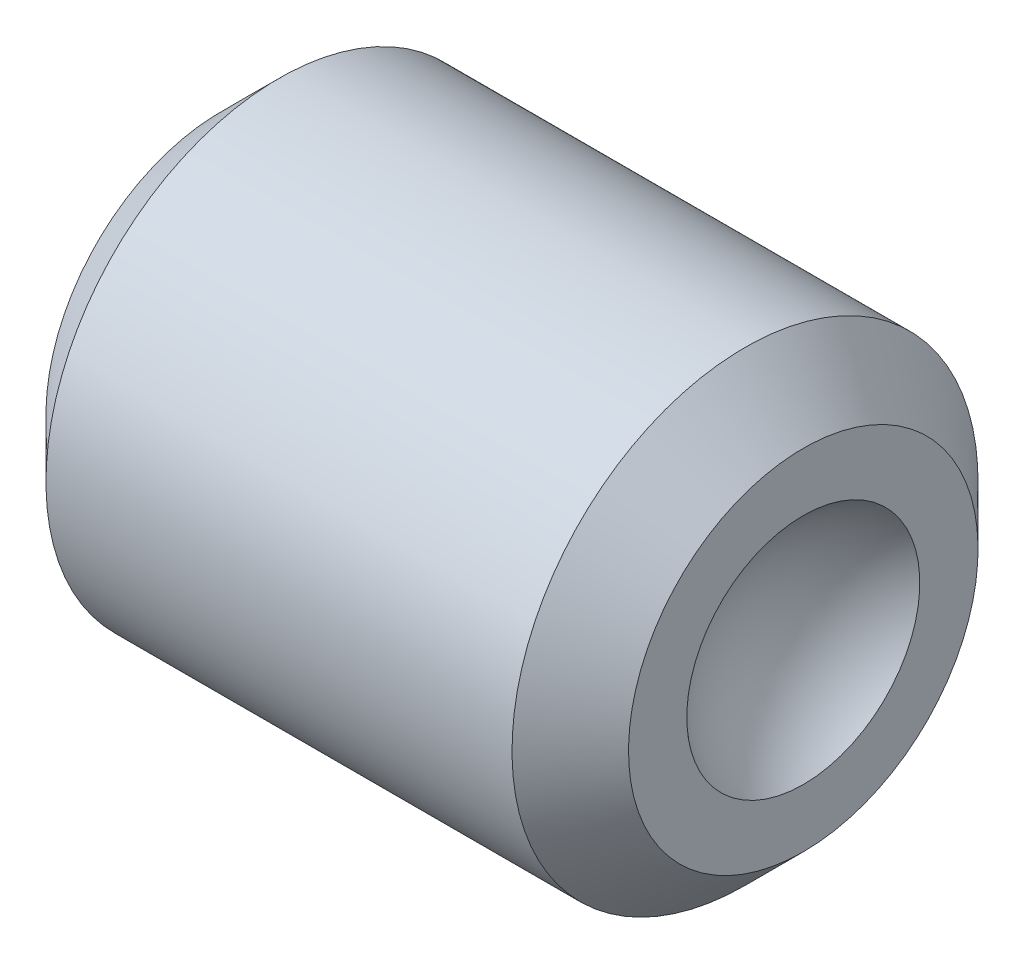
ISO-10303-21;
HEADER;
FILE_DESCRIPTION(('STEP AP214'),'2;1');
FILE_NAME('part.step','',(''),(''),'','','');
FILE_SCHEMA(('AUTOMOTIVE_DESIGN { 1 0 10303 214 1 1 1 1 }'));
ENDSEC;
DATA;
#1=APPLICATION_CONTEXT('core data for automotive mechanical design processes');
#2=APPLICATION_PROTOCOL_DEFINITION('international standard','automotive_design',2000,#1);
#3=PRODUCT_CONTEXT('',#1,'mechanical');
#4=PRODUCT('Part','Part','',(#3));
#5=PRODUCT_RELATED_PRODUCT_CATEGORY('part','',(#4));
#6=PRODUCT_DEFINITION_FORMATION('','',#4);
#7=PRODUCT_DEFINITION_CONTEXT('part definition',#1,'design');
#8=PRODUCT_DEFINITION('design','',#6,#7);
#9=PRODUCT_DEFINITION_SHAPE('','',#8);
#10=(LENGTH_UNIT() NAMED_UNIT(*) SI_UNIT(.MILLI.,.METRE.));
#11=(NAMED_UNIT(*) PLANE_ANGLE_UNIT() SI_UNIT($,.RADIAN.));
#12=(NAMED_UNIT(*) SI_UNIT($,.STERADIAN.) SOLID_ANGLE_UNIT());
#13=UNCERTAINTY_MEASURE_WITH_UNIT(LENGTH_MEASURE(1.E-05),#10,'distance_accuracy_value','');
#14=(GEOMETRIC_REPRESENTATION_CONTEXT(3) GLOBAL_UNCERTAINTY_ASSIGNED_CONTEXT((#13)) GLOBAL_UNIT_ASSIGNED_CONTEXT((#10,
#11,#12)) REPRESENTATION_CONTEXT('',''));
#15=CARTESIAN_POINT('',(0.,0.,0.));
#16=DIRECTION('',(0.,0.,1.));
#17=DIRECTION('',(1.,0.,0.));
#18=AXIS2_PLACEMENT_3D('',#15,#16,#17);
#19=CARTESIAN_POINT('',(0.,0.,0.));
#20=DIRECTION('',(1.,0.,0.));
#21=DIRECTION('',(0.,1.,0.));
#22=AXIS2_PLACEMENT_3D('',#19,#20,#21);
#23=PLANE('',#22);
#24=DIRECTION('',(0.,-0.5,-0.866025403784439));
#25=VECTOR('',#24,1.);
#26=CARTESIAN_POINT('',(0.,1.15470053837925,0.));
#27=LINE('',#26,#25);
#28=CARTESIAN_POINT('',(0.,1.15470053837925,0.));
#29=VERTEX_POINT('',#28);
#30=CARTESIAN_POINT('',(0.,0.577350269189626,-1.));
#31=VERTEX_POINT('',#30);
#32=EDGE_CURVE('E107',#29,#31,#27,.T.);
#33=ORIENTED_EDGE('',*,*,#32,.F.);
#34=DIRECTION('',(0.,0.5,-0.866025403784438));
#35=VECTOR('',#34,1.);
#36=CARTESIAN_POINT('',(0.,0.577350269189626,1.));
#37=LINE('',#36,#35);
#38=CARTESIAN_POINT('',(0.,0.577350269189626,1.));
#39=VERTEX_POINT('',#38);
#40=EDGE_CURVE('E49',#39,#29,#37,.T.);
#41=ORIENTED_EDGE('',*,*,#40,.F.);
#42=DIRECTION('',(0.,1.,0.));
#43=VECTOR('',#42,1.);
#44=CARTESIAN_POINT('',(0.,-0.577350269189626,1.));
#45=LINE('',#44,#43);
#46=CARTESIAN_POINT('',(0.,-0.577350269189626,1.));
#47=VERTEX_POINT('',#46);
#48=EDGE_CURVE('E122',#47,#39,#45,.T.);
#49=ORIENTED_EDGE('',*,*,#48,.F.);
#50=DIRECTION('',(0.,0.5,0.866025403784439));
#51=VECTOR('',#50,1.);
#52=CARTESIAN_POINT('',(0.,-1.15470053837925,0.));
#53=LINE('',#52,#51);
#54=CARTESIAN_POINT('',(0.,-1.15470053837925,0.));
#55=VERTEX_POINT('',#54);
#56=EDGE_CURVE('E116',#55,#47,#53,.T.);
#57=ORIENTED_EDGE('',*,*,#56,.F.);
#58=DIRECTION('',(0.,-0.5,0.866025403784438));
#59=VECTOR('',#58,1.);
#60=CARTESIAN_POINT('',(0.,-0.577350269189625,-1.));
#61=LINE('',#60,#59);
#62=CARTESIAN_POINT('',(0.,-0.577350269189625,-1.));
#63=VERTEX_POINT('',#62);
#64=EDGE_CURVE('E114',#63,#55,#61,.T.);
#65=ORIENTED_EDGE('',*,*,#64,.F.);
#66=DIRECTION('',(0.,-1.,0.));
#67=VECTOR('',#66,1.);
#68=CARTESIAN_POINT('',(0.,0.577350269189626,-1.));
#69=LINE('',#68,#67);
#70=EDGE_CURVE('E100',#31,#63,#69,.T.);
#71=ORIENTED_EDGE('',*,*,#70,.F.);
#72=EDGE_LOOP('',(#33,#41,#49,#57,#65,#71));
#73=FACE_BOUND('',#72,.T.);
#74=CARTESIAN_POINT('',(0.,0.,0.));
#75=DIRECTION('',(-1.,0.,0.));
#76=DIRECTION('',(0.,-1.,0.));
#77=AXIS2_PLACEMENT_3D('',#74,#75,#76);
#78=CIRCLE('',#77,1.5);
#79=CARTESIAN_POINT('',(0.,-1.5,0.));
#80=VERTEX_POINT('',#79);
#81=EDGE_CURVE('E12',#80,#80,#78,.T.);
#82=ORIENTED_EDGE('',*,*,#81,.T.);
#83=EDGE_LOOP('',(#82));
#84=FACE_BOUND('',#83,.T.);
#85=ADVANCED_FACE('F35',(#73,#84),#23,.F.);
#86=CARTESIAN_POINT('',(0.500000000000001,0.,0.));
#87=DIRECTION('',(1.,0.,0.));
#88=DIRECTION('',(0.,1.,0.));
#89=AXIS2_PLACEMENT_3D('',#86,#87,#88);
#90=CONICAL_SURFACE('',#89,2.,0.785398163397447);
#91=ORIENTED_EDGE('',*,*,#81,.F.);
#92=EDGE_LOOP('',(#91));
#93=FACE_BOUND('',#92,.T.);
#94=CARTESIAN_POINT('',(0.500000000000001,0.,0.));
#95=DIRECTION('',(-1.,0.,0.));
#96=DIRECTION('',(0.,-1.,0.));
#97=AXIS2_PLACEMENT_3D('',#94,#95,#96);
#98=CIRCLE('',#97,2.);
#99=CARTESIAN_POINT('',(0.500000000000001,-2.,0.));
#100=VERTEX_POINT('',#99);
#101=EDGE_CURVE('E42',#100,#100,#98,.T.);
#102=ORIENTED_EDGE('',*,*,#101,.T.);
#103=EDGE_LOOP('',(#102));
#104=FACE_BOUND('',#103,.T.);
#105=ADVANCED_FACE('F145',(#93,#104),#90,.T.);
#106=CARTESIAN_POINT('',(0.,0.,0.));
#107=DIRECTION('',(-1.,0.,0.));
#108=DIRECTION('',(0.,-1.,0.));
#109=AXIS2_PLACEMENT_3D('',#106,#107,#108);
#110=CYLINDRICAL_SURFACE('',#109,2.);
#111=ORIENTED_EDGE('',*,*,#101,.F.);
#112=EDGE_LOOP('',(#111));
#113=FACE_BOUND('',#112,.T.);
#114=CARTESIAN_POINT('',(4.5,0.,0.));
#115=DIRECTION('',(-1.,0.,0.));
#116=DIRECTION('',(0.,-1.,0.));
#117=AXIS2_PLACEMENT_3D('',#114,#115,#116);
#118=CIRCLE('',#117,2.);
#119=CARTESIAN_POINT('',(4.5,-2.,0.));
#120=VERTEX_POINT('',#119);
#121=EDGE_CURVE('E140',#120,#120,#118,.T.);
#122=ORIENTED_EDGE('',*,*,#121,.T.);
#123=EDGE_LOOP('',(#122));
#124=FACE_BOUND('',#123,.T.);
#125=ADVANCED_FACE('F147',(#113,#124),#110,.T.);
#126=CARTESIAN_POINT('',(5.,0.,0.));
#127=DIRECTION('',(-1.,0.,0.));
#128=DIRECTION('',(0.,-1.,0.));
#129=AXIS2_PLACEMENT_3D('',#126,#127,#128);
#130=CONICAL_SURFACE('',#129,1.5,0.785398163397449);
#131=ORIENTED_EDGE('',*,*,#121,.F.);
#132=EDGE_LOOP('',(#131));
#133=FACE_BOUND('',#132,.T.);
#134=CARTESIAN_POINT('',(5.,0.,0.));
#135=DIRECTION('',(-1.,0.,0.));
#136=DIRECTION('',(0.,-1.,0.));
#137=AXIS2_PLACEMENT_3D('',#134,#135,#136);
#138=CIRCLE('',#137,1.5);
#139=CARTESIAN_POINT('',(5.,-1.5,0.));
#140=VERTEX_POINT('',#139);
#141=EDGE_CURVE('E137',#140,#140,#138,.T.);
#142=ORIENTED_EDGE('',*,*,#141,.T.);
#143=EDGE_LOOP('',(#142));
#144=FACE_BOUND('',#143,.T.);
#145=ADVANCED_FACE('F150',(#133,#144),#130,.T.);
#146=CARTESIAN_POINT('',(5.,1.5,0.));
#147=DIRECTION('',(-1.,0.,0.));
#148=DIRECTION('',(0.,-1.,0.));
#149=AXIS2_PLACEMENT_3D('',#146,#147,#148);
#150=PLANE('',#149);
#151=ORIENTED_EDGE('',*,*,#141,.F.);
#152=EDGE_LOOP('',(#151));
#153=FACE_BOUND('',#152,.T.);
#154=CARTESIAN_POINT('',(5.,0.,0.));
#155=DIRECTION('',(-1.,0.,0.));
#156=DIRECTION('',(0.,-1.,0.));
#157=AXIS2_PLACEMENT_3D('',#154,#155,#156);
#158=CIRCLE('',#157,1.);
#159=CARTESIAN_POINT('',(5.,-1.,0.));
#160=VERTEX_POINT('',#159);
#161=EDGE_CURVE('E134',#160,#160,#158,.T.);
#162=ORIENTED_EDGE('',*,*,#161,.T.);
#163=EDGE_LOOP('',(#162));
#164=FACE_BOUND('',#163,.T.);
#165=ADVANCED_FACE('F156',(#153,#164),#150,.F.);
#166=CARTESIAN_POINT('',(5.75,0.,0.));
#167=DIRECTION('',(-1.,0.,0.));
#168=DIRECTION('',(0.,-1.,0.));
#169=AXIS2_PLACEMENT_3D('',#166,#167,#168);
#170=SPHERICAL_SURFACE('',#169,1.25);
#171=ORIENTED_EDGE('',*,*,#161,.F.);
#172=EDGE_LOOP('',(#171));
#173=FACE_BOUND('',#172,.T.);
#174=ADVANCED_FACE('F162',(#173),#170,.F.);
#175=CARTESIAN_POINT('',(8.05505046330389,0.577350269189626,1.));
#176=DIRECTION('',(0.,0.866025403784439,0.5));
#177=DIRECTION('',(0.,-0.5,0.866025403784438));
#178=AXIS2_PLACEMENT_3D('',#175,#176,#177);
#179=PLANE('',#178);
#180=DIRECTION('',(0.,-0.5,0.866025403784438));
#181=VECTOR('',#180,1.);
#182=CARTESIAN_POINT('',(3.,0.577350269189626,1.));
#183=LINE('',#182,#181);
#184=CARTESIAN_POINT('',(3.,1.15470053837925,0.));
#185=VERTEX_POINT('',#184);
#186=CARTESIAN_POINT('',(3.,0.577350269189626,1.));
#187=VERTEX_POINT('',#186);
#188=EDGE_CURVE('E68',#185,#187,#183,.T.);
#189=ORIENTED_EDGE('',*,*,#188,.T.);
#190=DIRECTION('',(-1.,0.,0.));
#191=VECTOR('',#190,1.);
#192=CARTESIAN_POINT('',(8.05505046330389,0.577350269189626,1.));
#193=LINE('',#192,#191);
#194=EDGE_CURVE('E125',#187,#39,#193,.T.);
#195=ORIENTED_EDGE('',*,*,#194,.T.);
#196=ORIENTED_EDGE('',*,*,#40,.T.);
#197=DIRECTION('',(-1.,0.,0.));
#198=VECTOR('',#197,1.);
#199=CARTESIAN_POINT('',(8.05505046330389,1.15470053837925,0.));
#200=LINE('',#199,#198);
#201=EDGE_CURVE('E104',#185,#29,#200,.T.);
#202=ORIENTED_EDGE('',*,*,#201,.F.);
#203=EDGE_LOOP('',(#189,#195,#196,#202));
#204=FACE_BOUND('',#203,.T.);
#205=ADVANCED_FACE('F167',(#204),#179,.F.);
#206=CARTESIAN_POINT('',(8.05505046330389,-0.577350269189626,1.));
#207=DIRECTION('',(0.,0.,1.));
#208=DIRECTION('',(1.,0.,0.));
#209=AXIS2_PLACEMENT_3D('',#206,#207,#208);
#210=PLANE('',#209);
#211=DIRECTION('',(0.,-1.,0.));
#212=VECTOR('',#211,1.);
#213=CARTESIAN_POINT('',(3.,-0.577350269189626,1.));
#214=LINE('',#213,#212);
#215=CARTESIAN_POINT('',(3.,-0.577350269189626,1.));
#216=VERTEX_POINT('',#215);
#217=EDGE_CURVE('E267',#187,#216,#214,.T.);
#218=ORIENTED_EDGE('',*,*,#217,.T.);
#219=DIRECTION('',(-1.,0.,0.));
#220=VECTOR('',#219,1.);
#221=CARTESIAN_POINT('',(8.05505046330389,-0.577350269189626,1.));
#222=LINE('',#221,#220);
#223=EDGE_CURVE('E127',#216,#47,#222,.T.);
#224=ORIENTED_EDGE('',*,*,#223,.T.);
#225=ORIENTED_EDGE('',*,*,#48,.T.);
#226=ORIENTED_EDGE('',*,*,#194,.F.);
#227=EDGE_LOOP('',(#218,#224,#225,#226));
#228=FACE_BOUND('',#227,.T.);
#229=ADVANCED_FACE('F172',(#228),#210,.F.);
#230=CARTESIAN_POINT('',(8.05505046330389,-1.15470053837925,0.));
#231=DIRECTION('',(0.,-0.866025403784439,0.5));
#232=DIRECTION('',(0.,-0.5,-0.866025403784439));
#233=AXIS2_PLACEMENT_3D('',#230,#231,#232);
#234=PLANE('',#233);
#235=DIRECTION('',(0.,-0.5,-0.866025403784439));
#236=VECTOR('',#235,1.);
#237=CARTESIAN_POINT('',(3.,-1.15470053837925,0.));
#238=LINE('',#237,#236);
#239=CARTESIAN_POINT('',(3.,-1.15470053837925,0.));
#240=VERTEX_POINT('',#239);
#241=EDGE_CURVE('E270',#216,#240,#238,.T.);
#242=ORIENTED_EDGE('',*,*,#241,.T.);
#243=DIRECTION('',(-1.,0.,0.));
#244=VECTOR('',#243,1.);
#245=CARTESIAN_POINT('',(8.05505046330389,-1.15470053837925,0.));
#246=LINE('',#245,#244);
#247=EDGE_CURVE('E129',#240,#55,#246,.T.);
#248=ORIENTED_EDGE('',*,*,#247,.T.);
#249=ORIENTED_EDGE('',*,*,#56,.T.);
#250=ORIENTED_EDGE('',*,*,#223,.F.);
#251=EDGE_LOOP('',(#242,#248,#249,#250));
#252=FACE_BOUND('',#251,.T.);
#253=ADVANCED_FACE('F217',(#252),#234,.F.);
#254=CARTESIAN_POINT('',(8.05505046330389,-0.577350269189626,-1.));
#255=DIRECTION('',(0.,-0.866025403784439,-0.5));
#256=DIRECTION('',(0.,0.5,-0.866025403784438));
#257=AXIS2_PLACEMENT_3D('',#254,#255,#256);
#258=PLANE('',#257);
#259=DIRECTION('',(0.,0.5,-0.866025403784438));
#260=VECTOR('',#259,1.);
#261=CARTESIAN_POINT('',(3.,-0.577350269189625,-1.));
#262=LINE('',#261,#260);
#263=CARTESIAN_POINT('',(3.,-0.577350269189626,-1.));
#264=VERTEX_POINT('',#263);
#265=EDGE_CURVE('E58',#240,#264,#262,.T.);
#266=ORIENTED_EDGE('',*,*,#265,.T.);
#267=DIRECTION('',(-1.,0.,0.));
#268=VECTOR('',#267,1.);
#269=CARTESIAN_POINT('',(8.05505046330389,-0.577350269189626,-1.));
#270=LINE('',#269,#268);
#271=EDGE_CURVE('E103',#264,#63,#270,.T.);
#272=ORIENTED_EDGE('',*,*,#271,.T.);
#273=ORIENTED_EDGE('',*,*,#64,.T.);
#274=ORIENTED_EDGE('',*,*,#247,.F.);
#275=EDGE_LOOP('',(#266,#272,#273,#274));
#276=FACE_BOUND('',#275,.T.);
#277=ADVANCED_FACE('F227',(#276),#258,.F.);
#278=CARTESIAN_POINT('',(8.05505046330389,0.577350269189626,-1.));
#279=DIRECTION('',(0.,0.,-1.));
#280=DIRECTION('',(-1.,0.,0.));
#281=AXIS2_PLACEMENT_3D('',#278,#279,#280);
#282=PLANE('',#281);
#283=DIRECTION('',(0.,1.,0.));
#284=VECTOR('',#283,1.);
#285=CARTESIAN_POINT('',(3.,0.577350269189626,-1.));
#286=LINE('',#285,#284);
#287=CARTESIAN_POINT('',(3.,0.577350269189626,-1.));
#288=VERTEX_POINT('',#287);
#289=EDGE_CURVE('E102',#264,#288,#286,.T.);
#290=ORIENTED_EDGE('',*,*,#289,.T.);
#291=DIRECTION('',(-1.,0.,0.));
#292=VECTOR('',#291,1.);
#293=CARTESIAN_POINT('',(8.05505046330389,0.577350269189626,-1.));
#294=LINE('',#293,#292);
#295=EDGE_CURVE('E95',#288,#31,#294,.T.);
#296=ORIENTED_EDGE('',*,*,#295,.T.);
#297=ORIENTED_EDGE('',*,*,#70,.T.);
#298=ORIENTED_EDGE('',*,*,#271,.F.);
#299=EDGE_LOOP('',(#290,#296,#297,#298));
#300=FACE_BOUND('',#299,.T.);
#301=ADVANCED_FACE('F97',(#300),#282,.F.);
#302=CARTESIAN_POINT('',(8.05505046330389,1.15470053837925,0.));
#303=DIRECTION('',(0.,0.866025403784439,-0.5));
#304=DIRECTION('',(0.,0.5,0.866025403784439));
#305=AXIS2_PLACEMENT_3D('',#302,#303,#304);
#306=PLANE('',#305);
#307=DIRECTION('',(0.,0.5,0.866025403784439));
#308=VECTOR('',#307,1.);
#309=CARTESIAN_POINT('',(3.,1.15470053837925,0.));
#310=LINE('',#309,#308);
#311=EDGE_CURVE('E77',#288,#185,#310,.T.);
#312=ORIENTED_EDGE('',*,*,#311,.T.);
#313=ORIENTED_EDGE('',*,*,#201,.T.);
#314=ORIENTED_EDGE('',*,*,#32,.T.);
#315=ORIENTED_EDGE('',*,*,#295,.F.);
#316=EDGE_LOOP('',(#312,#313,#314,#315));
#317=FACE_BOUND('',#316,.T.);
#318=ADVANCED_FACE('F108',(#317),#306,.F.);
#319=CARTESIAN_POINT('',(3.,1.5,0.));
#320=DIRECTION('',(-1.,0.,0.));
#321=DIRECTION('',(0.,-1.,0.));
#322=AXIS2_PLACEMENT_3D('',#319,#320,#321);
#323=PLANE('',#322);
#324=ORIENTED_EDGE('',*,*,#188,.F.);
#325=ORIENTED_EDGE('',*,*,#311,.F.);
#326=ORIENTED_EDGE('',*,*,#289,.F.);
#327=ORIENTED_EDGE('',*,*,#265,.F.);
#328=ORIENTED_EDGE('',*,*,#241,.F.);
#329=ORIENTED_EDGE('',*,*,#217,.F.);
#330=EDGE_LOOP('',(#324,#325,#326,#327,#328,#329));
#331=FACE_BOUND('',#330,.T.);
#332=ADVANCED_FACE('F253',(#331),#323,.T.);
#333=CLOSED_SHELL('',(#85,#105,#125,#145,#165,#174,#205,#229,#253,#277,#301,#318,#332));
#334=MANIFOLD_SOLID_BREP('B2',#333);
#335=ADVANCED_BREP_SHAPE_REPRESENTATION('',(#18,#334),#14);
#336=SHAPE_DEFINITION_REPRESENTATION(#9,#335);
ENDSEC;
END-ISO-10303-21;
